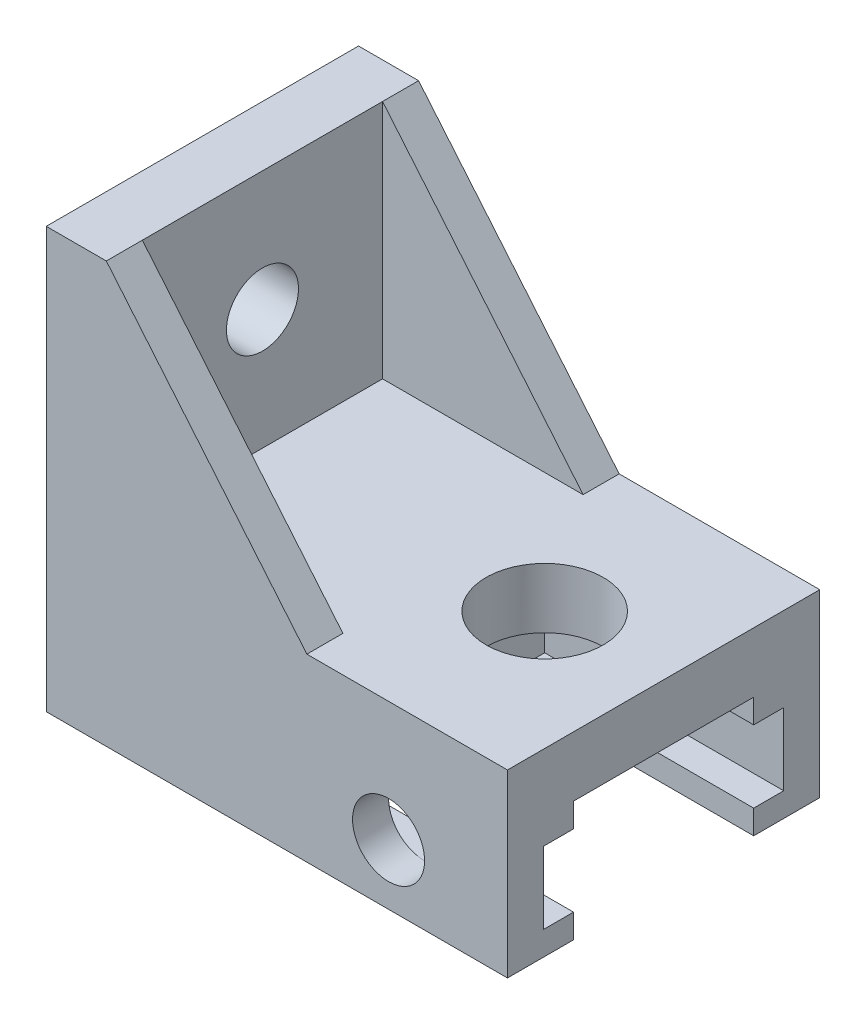
ISO-10303-21;
HEADER;
FILE_DESCRIPTION(('STEP AP214'),'2;1');
FILE_NAME('part.step','',(''),(''),'','','');
FILE_SCHEMA(('AUTOMOTIVE_DESIGN { 1 0 10303 214 1 1 1 1 }'));
ENDSEC;
DATA;
#1=APPLICATION_CONTEXT('core data for automotive mechanical design processes');
#2=APPLICATION_PROTOCOL_DEFINITION('international standard','automotive_design',2000,#1);
#3=PRODUCT_CONTEXT('',#1,'mechanical');
#4=PRODUCT('Part','Part','',(#3));
#5=PRODUCT_RELATED_PRODUCT_CATEGORY('part','',(#4));
#6=PRODUCT_DEFINITION_FORMATION('','',#4);
#7=PRODUCT_DEFINITION_CONTEXT('part definition',#1,'design');
#8=PRODUCT_DEFINITION('design','',#6,#7);
#9=PRODUCT_DEFINITION_SHAPE('','',#8);
#10=(LENGTH_UNIT() NAMED_UNIT(*) SI_UNIT(.MILLI.,.METRE.));
#11=(NAMED_UNIT(*) PLANE_ANGLE_UNIT() SI_UNIT($,.RADIAN.));
#12=(NAMED_UNIT(*) SI_UNIT($,.STERADIAN.) SOLID_ANGLE_UNIT());
#13=UNCERTAINTY_MEASURE_WITH_UNIT(LENGTH_MEASURE(1.E-05),#10,'distance_accuracy_value','');
#14=(GEOMETRIC_REPRESENTATION_CONTEXT(3) GLOBAL_UNCERTAINTY_ASSIGNED_CONTEXT((#13)) GLOBAL_UNIT_ASSIGNED_CONTEXT((#10,
#11,#12)) REPRESENTATION_CONTEXT('',''));
#15=CARTESIAN_POINT('',(0.,0.,0.));
#16=DIRECTION('',(0.,0.,1.));
#17=DIRECTION('',(1.,0.,0.));
#18=AXIS2_PLACEMENT_3D('',#15,#16,#17);
#19=CARTESIAN_POINT('',(-23.5,35.,-13.));
#20=DIRECTION('',(-1.,0.,0.));
#21=DIRECTION('',(0.,0.,1.));
#22=AXIS2_PLACEMENT_3D('',#19,#20,#21);
#23=PLANE('',#22);
#24=CARTESIAN_POINT('',(-23.5,25.,0.));
#25=DIRECTION('',(1.,0.,0.));
#26=DIRECTION('',(0.,0.,-1.));
#27=AXIS2_PLACEMENT_3D('',#24,#25,#26);
#28=CIRCLE('',#27,3.);
#29=CARTESIAN_POINT('',(-23.5,25.,-3.));
#30=VERTEX_POINT('',#29);
#31=EDGE_CURVE('E223',#30,#30,#28,.T.);
#32=ORIENTED_EDGE('',*,*,#31,.F.);
#33=EDGE_LOOP('',(#32));
#34=FACE_BOUND('',#33,.T.);
#35=DIRECTION('',(0.,-1.,0.));
#36=VECTOR('',#35,1.);
#37=CARTESIAN_POINT('',(-23.5,15.,10.));
#38=LINE('',#37,#36);
#39=CARTESIAN_POINT('',(-23.5,35.,10.));
#40=VERTEX_POINT('',#39);
#41=CARTESIAN_POINT('',(-23.5,15.,10.));
#42=VERTEX_POINT('',#41);
#43=EDGE_CURVE('E196',#40,#42,#38,.T.);
#44=ORIENTED_EDGE('',*,*,#43,.T.);
#45=DIRECTION('',(0.,0.,-1.));
#46=VECTOR('',#45,1.);
#47=CARTESIAN_POINT('',(-23.5,15.,-13.));
#48=LINE('',#47,#46);
#49=CARTESIAN_POINT('',(-23.5,15.,-10.));
#50=VERTEX_POINT('',#49);
#51=EDGE_CURVE('E204',#42,#50,#48,.T.);
#52=ORIENTED_EDGE('',*,*,#51,.T.);
#53=DIRECTION('',(0.,1.,0.));
#54=VECTOR('',#53,1.);
#55=CARTESIAN_POINT('',(-23.5,15.,-10.));
#56=LINE('',#55,#54);
#57=CARTESIAN_POINT('',(-23.5,35.,-10.));
#58=VERTEX_POINT('',#57);
#59=EDGE_CURVE('E399',#50,#58,#56,.T.);
#60=ORIENTED_EDGE('',*,*,#59,.T.);
#61=DIRECTION('',(0.,0.,-1.));
#62=VECTOR('',#61,1.);
#63=CARTESIAN_POINT('',(-23.5,35.,-13.));
#64=LINE('',#63,#62);
#65=EDGE_CURVE('E206',#40,#58,#64,.T.);
#66=ORIENTED_EDGE('',*,*,#65,.F.);
#67=EDGE_LOOP('',(#44,#52,#60,#66));
#68=FACE_BOUND('',#67,.T.);
#69=ADVANCED_FACE('F38',(#34,#68),#23,.F.);
#70=CARTESIAN_POINT('',(-10.,0.,9.99999999999999));
#71=DIRECTION('',(0.,0.,1.));
#72=DIRECTION('',(1.,0.,0.));
#73=AXIS2_PLACEMENT_3D('',#70,#71,#72);
#74=PLANE('',#73);
#75=DIRECTION('',(1.,0.,0.));
#76=VECTOR('',#75,1.);
#77=CARTESIAN_POINT('',(-10.,8.00000000000002,9.99999999999999));
#78=LINE('',#77,#76);
#79=CARTESIAN_POINT('',(-10.,8.00000000000002,9.99999999999999));
#80=VERTEX_POINT('',#79);
#81=CARTESIAN_POINT('',(0.,8.00000000000002,9.99999999999999));
#82=VERTEX_POINT('',#81);
#83=EDGE_CURVE('E333',#80,#82,#78,.T.);
#84=ORIENTED_EDGE('',*,*,#83,.T.);
#85=CARTESIAN_POINT('',(0.,5.00000000000001,9.99999999999999));
#86=DIRECTION('',(0.,0.,1.));
#87=DIRECTION('',(1.,0.,0.));
#88=AXIS2_PLACEMENT_3D('',#85,#86,#87);
#89=CIRCLE('',#88,3.);
#90=CARTESIAN_POINT('',(0.,2.00000000000002,9.99999999999999));
#91=VERTEX_POINT('',#90);
#92=EDGE_CURVE('E61',#82,#91,#89,.T.);
#93=ORIENTED_EDGE('',*,*,#92,.T.);
#94=DIRECTION('',(1.,0.,0.));
#95=VECTOR('',#94,1.);
#96=CARTESIAN_POINT('',(-10.,2.00000000000002,9.99999999999999));
#97=LINE('',#96,#95);
#98=CARTESIAN_POINT('',(-10.,2.00000000000002,9.99999999999999));
#99=VERTEX_POINT('',#98);
#100=EDGE_CURVE('E329',#99,#91,#97,.T.);
#101=ORIENTED_EDGE('',*,*,#100,.F.);
#102=DIRECTION('',(0.,-1.,0.));
#103=VECTOR('',#102,1.);
#104=CARTESIAN_POINT('',(-10.,0.,9.99999999999999));
#105=LINE('',#104,#103);
#106=EDGE_CURVE('E308',#80,#99,#105,.T.);
#107=ORIENTED_EDGE('',*,*,#106,.F.);
#108=EDGE_LOOP('',(#84,#93,#101,#107));
#109=FACE_BOUND('',#108,.T.);
#110=ADVANCED_FACE('F489',(#109),#74,.F.);
#111=CARTESIAN_POINT('',(-10.,0.,-10.));
#112=DIRECTION('',(0.,0.,1.));
#113=DIRECTION('',(0.,-1.,0.));
#114=AXIS2_PLACEMENT_3D('',#111,#112,#113);
#115=PLANE('',#114);
#116=CARTESIAN_POINT('',(0.,5.00000000000001,-10.));
#117=DIRECTION('',(0.,0.,1.));
#118=DIRECTION('',(0.,-1.,0.));
#119=AXIS2_PLACEMENT_3D('',#116,#117,#118);
#120=CIRCLE('',#119,3.);
#121=CARTESIAN_POINT('',(0.,2.00000000000001,-10.));
#122=VERTEX_POINT('',#121);
#123=CARTESIAN_POINT('',(0.,8.00000000000002,-10.));
#124=VERTEX_POINT('',#123);
#125=EDGE_CURVE('E248',#122,#124,#120,.T.);
#126=ORIENTED_EDGE('',*,*,#125,.F.);
#127=DIRECTION('',(1.,0.,0.));
#128=VECTOR('',#127,1.);
#129=CARTESIAN_POINT('',(-10.,2.00000000000002,-10.));
#130=LINE('',#129,#128);
#131=CARTESIAN_POINT('',(9.89871535516885,2.00000000000002,-10.));
#132=VERTEX_POINT('',#131);
#133=EDGE_CURVE('E354',#122,#132,#130,.T.);
#134=ORIENTED_EDGE('',*,*,#133,.T.);
#135=DIRECTION('',(0.,-1.,0.));
#136=VECTOR('',#135,1.);
#137=CARTESIAN_POINT('',(9.89871535516885,0.,-10.));
#138=LINE('',#137,#136);
#139=CARTESIAN_POINT('',(9.89871535516886,8.00000000000002,-10.));
#140=VERTEX_POINT('',#139);
#141=EDGE_CURVE('E260',#140,#132,#138,.T.);
#142=ORIENTED_EDGE('',*,*,#141,.F.);
#143=DIRECTION('',(1.,0.,0.));
#144=VECTOR('',#143,1.);
#145=CARTESIAN_POINT('',(-10.,8.00000000000002,-10.));
#146=LINE('',#145,#144);
#147=EDGE_CURVE('E350',#124,#140,#146,.T.);
#148=ORIENTED_EDGE('',*,*,#147,.F.);
#149=EDGE_LOOP('',(#126,#134,#142,#148));
#150=FACE_BOUND('',#149,.T.);
#151=ADVANCED_FACE('F464',(#150),#115,.T.);
#152=CARTESIAN_POINT('',(0.,0.,0.));
#153=DIRECTION('',(0.,1.,0.));
#154=DIRECTION('',(0.,0.,1.));
#155=AXIS2_PLACEMENT_3D('',#152,#153,#154);
#156=PLANE('',#155);
#157=DIRECTION('',(-1.,0.,0.));
#158=VECTOR('',#157,1.);
#159=CARTESIAN_POINT('',(-13.5,0.,-13.));
#160=LINE('',#159,#158);
#161=CARTESIAN_POINT('',(9.89871535516886,0.,-13.));
#162=VERTEX_POINT('',#161);
#163=CARTESIAN_POINT('',(-28.5,0.,-13.));
#164=VERTEX_POINT('',#163);
#165=EDGE_CURVE('E323',#162,#164,#160,.T.);
#166=ORIENTED_EDGE('',*,*,#165,.F.);
#167=DIRECTION('',(0.,0.,-1.));
#168=VECTOR('',#167,1.);
#169=CARTESIAN_POINT('',(9.89871535516886,0.,13.));
#170=LINE('',#169,#168);
#171=CARTESIAN_POINT('',(9.89871535516886,0.,-7.50000000000002));
#172=VERTEX_POINT('',#171);
#173=EDGE_CURVE('E254',#172,#162,#170,.T.);
#174=ORIENTED_EDGE('',*,*,#173,.F.);
#175=DIRECTION('',(1.,0.,0.));
#176=VECTOR('',#175,1.);
#177=CARTESIAN_POINT('',(-10.,0.,-7.50000000000001));
#178=LINE('',#177,#176);
#179=CARTESIAN_POINT('',(-10.,0.,-7.50000000000001));
#180=VERTEX_POINT('',#179);
#181=EDGE_CURVE('E320',#180,#172,#178,.T.);
#182=ORIENTED_EDGE('',*,*,#181,.F.);
#183=DIRECTION('',(0.,0.,-1.));
#184=VECTOR('',#183,1.);
#185=CARTESIAN_POINT('',(-10.,0.,0.));
#186=LINE('',#185,#184);
#187=CARTESIAN_POINT('',(-10.,0.,7.49999999999999));
#188=VERTEX_POINT('',#187);
#189=EDGE_CURVE('E316',#188,#180,#186,.T.);
#190=ORIENTED_EDGE('',*,*,#189,.F.);
#191=DIRECTION('',(1.,0.,0.));
#192=VECTOR('',#191,1.);
#193=CARTESIAN_POINT('',(-10.,0.,7.49999999999999));
#194=LINE('',#193,#192);
#195=CARTESIAN_POINT('',(9.89871535516886,0.,7.49999999999998));
#196=VERTEX_POINT('',#195);
#197=EDGE_CURVE('E324',#188,#196,#194,.T.);
#198=ORIENTED_EDGE('',*,*,#197,.T.);
#199=CARTESIAN_POINT('',(9.89871535516886,0.,13.));
#200=VERTEX_POINT('',#199);
#201=EDGE_CURVE('E261',#200,#196,#170,.T.);
#202=ORIENTED_EDGE('',*,*,#201,.F.);
#203=DIRECTION('',(1.,0.,0.));
#204=VECTOR('',#203,1.);
#205=CARTESIAN_POINT('',(-13.5,0.,13.));
#206=LINE('',#205,#204);
#207=CARTESIAN_POINT('',(-28.5,0.,13.));
#208=VERTEX_POINT('',#207);
#209=EDGE_CURVE('E359',#208,#200,#206,.T.);
#210=ORIENTED_EDGE('',*,*,#209,.F.);
#211=DIRECTION('',(0.,0.,1.));
#212=VECTOR('',#211,1.);
#213=CARTESIAN_POINT('',(-28.5,0.,-13.));
#214=LINE('',#213,#212);
#215=EDGE_CURVE('E232',#164,#208,#214,.T.);
#216=ORIENTED_EDGE('',*,*,#215,.F.);
#217=EDGE_LOOP('',(#166,#174,#182,#190,#198,#202,#210,#216));
#218=FACE_BOUND('',#217,.T.);
#219=ADVANCED_FACE('F373',(#218),#156,.F.);
#220=CARTESIAN_POINT('',(-13.5,15.,-13.));
#221=DIRECTION('',(0.,0.,1.));
#222=DIRECTION('',(1.,0.,0.));
#223=AXIS2_PLACEMENT_3D('',#220,#221,#222);
#224=PLANE('',#223);
#225=CARTESIAN_POINT('',(0.,5.00000000000001,-13.));
#226=DIRECTION('',(0.,0.,-1.));
#227=DIRECTION('',(-1.,0.,0.));
#228=AXIS2_PLACEMENT_3D('',#225,#226,#227);
#229=CIRCLE('',#228,3.);
#230=CARTESIAN_POINT('',(-3.,5.00000000000001,-13.));
#231=VERTEX_POINT('',#230);
#232=EDGE_CURVE('E244',#231,#231,#229,.T.);
#233=ORIENTED_EDGE('',*,*,#232,.F.);
#234=EDGE_LOOP('',(#233));
#235=FACE_BOUND('',#234,.T.);
#236=DIRECTION('',(-1.,0.,0.));
#237=VECTOR('',#236,1.);
#238=CARTESIAN_POINT('',(-13.5,15.,-13.));
#239=LINE('',#238,#237);
#240=CARTESIAN_POINT('',(9.89871535516886,15.,-13.));
#241=VERTEX_POINT('',#240);
#242=CARTESIAN_POINT('',(-6.80064232241557,15.,-13.));
#243=VERTEX_POINT('',#242);
#244=EDGE_CURVE('E356',#241,#243,#239,.T.);
#245=ORIENTED_EDGE('',*,*,#244,.F.);
#246=DIRECTION('',(0.,1.,0.));
#247=VECTOR('',#246,1.);
#248=CARTESIAN_POINT('',(9.89871535516886,15.,-13.));
#249=LINE('',#248,#247);
#250=EDGE_CURVE('E255',#162,#241,#249,.T.);
#251=ORIENTED_EDGE('',*,*,#250,.F.);
#252=ORIENTED_EDGE('',*,*,#165,.T.);
#253=DIRECTION('',(0.,-1.,0.));
#254=VECTOR('',#253,1.);
#255=CARTESIAN_POINT('',(-28.5,15.,-13.));
#256=LINE('',#255,#254);
#257=CARTESIAN_POINT('',(-28.5,35.,-13.));
#258=VERTEX_POINT('',#257);
#259=EDGE_CURVE('E229',#258,#164,#256,.T.);
#260=ORIENTED_EDGE('',*,*,#259,.F.);
#261=DIRECTION('',(-1.,0.,0.));
#262=VECTOR('',#261,1.);
#263=CARTESIAN_POINT('',(-28.5,35.,-13.));
#264=LINE('',#263,#262);
#265=CARTESIAN_POINT('',(-23.5,35.,-13.));
#266=VERTEX_POINT('',#265);
#267=EDGE_CURVE('E227',#266,#258,#264,.T.);
#268=ORIENTED_EDGE('',*,*,#267,.F.);
#269=DIRECTION('',(0.640924573481282,-0.767603863400802,0.));
#270=VECTOR('',#269,1.);
#271=CARTESIAN_POINT('',(-23.5,35.,-13.));
#272=LINE('',#271,#270);
#273=EDGE_CURVE('E397',#266,#243,#272,.T.);
#274=ORIENTED_EDGE('',*,*,#273,.T.);
#275=EDGE_LOOP('',(#245,#251,#252,#260,#268,#274));
#276=FACE_BOUND('',#275,.T.);
#277=ADVANCED_FACE('F40',(#235,#276),#224,.F.);
#278=CARTESIAN_POINT('',(-13.5,15.,13.));
#279=DIRECTION('',(0.,0.,-1.));
#280=DIRECTION('',(-1.,0.,0.));
#281=AXIS2_PLACEMENT_3D('',#278,#279,#280);
#282=PLANE('',#281);
#283=DIRECTION('',(1.,0.,0.));
#284=VECTOR('',#283,1.);
#285=CARTESIAN_POINT('',(-13.5,15.,13.));
#286=LINE('',#285,#284);
#287=CARTESIAN_POINT('',(-6.80064232241557,15.,13.));
#288=VERTEX_POINT('',#287);
#289=CARTESIAN_POINT('',(9.89871535516886,15.,13.));
#290=VERTEX_POINT('',#289);
#291=EDGE_CURVE('E47',#288,#290,#286,.T.);
#292=ORIENTED_EDGE('',*,*,#291,.F.);
#293=DIRECTION('',(-0.640924573481282,0.767603863400802,0.));
#294=VECTOR('',#293,1.);
#295=CARTESIAN_POINT('',(-23.5,35.,13.));
#296=LINE('',#295,#294);
#297=CARTESIAN_POINT('',(-23.5,35.,13.));
#298=VERTEX_POINT('',#297);
#299=EDGE_CURVE('E208',#288,#298,#296,.T.);
#300=ORIENTED_EDGE('',*,*,#299,.T.);
#301=DIRECTION('',(1.,0.,0.));
#302=VECTOR('',#301,1.);
#303=CARTESIAN_POINT('',(-28.5,35.,13.));
#304=LINE('',#303,#302);
#305=CARTESIAN_POINT('',(-28.5,35.,13.));
#306=VERTEX_POINT('',#305);
#307=EDGE_CURVE('E220',#306,#298,#304,.T.);
#308=ORIENTED_EDGE('',*,*,#307,.F.);
#309=DIRECTION('',(0.,1.,0.));
#310=VECTOR('',#309,1.);
#311=CARTESIAN_POINT('',(-28.5,15.,13.));
#312=LINE('',#311,#310);
#313=EDGE_CURVE('E235',#208,#306,#312,.T.);
#314=ORIENTED_EDGE('',*,*,#313,.F.);
#315=ORIENTED_EDGE('',*,*,#209,.T.);
#316=DIRECTION('',(0.,1.,0.));
#317=VECTOR('',#316,1.);
#318=CARTESIAN_POINT('',(9.89871535516886,15.,13.));
#319=LINE('',#318,#317);
#320=EDGE_CURVE('E251',#200,#290,#319,.T.);
#321=ORIENTED_EDGE('',*,*,#320,.T.);
#322=EDGE_LOOP('',(#292,#300,#308,#314,#315,#321));
#323=FACE_BOUND('',#322,.T.);
#324=CARTESIAN_POINT('',(0.,5.00000000000001,13.));
#325=DIRECTION('',(0.,0.,-1.));
#326=DIRECTION('',(-1.,0.,0.));
#327=AXIS2_PLACEMENT_3D('',#324,#325,#326);
#328=CIRCLE('',#327,3.);
#329=CARTESIAN_POINT('',(-3.,5.00000000000001,13.));
#330=VERTEX_POINT('',#329);
#331=EDGE_CURVE('E240',#330,#330,#328,.T.);
#332=ORIENTED_EDGE('',*,*,#331,.T.);
#333=EDGE_LOOP('',(#332));
#334=FACE_BOUND('',#333,.T.);
#335=ADVANCED_FACE('F366',(#323,#334),#282,.F.);
#336=CARTESIAN_POINT('',(0.,15.,0.));
#337=DIRECTION('',(0.,1.,0.));
#338=DIRECTION('',(0.,0.,1.));
#339=AXIS2_PLACEMENT_3D('',#336,#337,#338);
#340=PLANE('',#339);
#341=DIRECTION('',(0.,0.,1.));
#342=VECTOR('',#341,1.);
#343=CARTESIAN_POINT('',(-6.80064232241557,15.,10.));
#344=LINE('',#343,#342);
#345=CARTESIAN_POINT('',(-6.80064232241557,15.,10.));
#346=VERTEX_POINT('',#345);
#347=EDGE_CURVE('E400',#346,#288,#344,.T.);
#348=ORIENTED_EDGE('',*,*,#347,.T.);
#349=ORIENTED_EDGE('',*,*,#291,.T.);
#350=DIRECTION('',(0.,0.,-1.));
#351=VECTOR('',#350,1.);
#352=CARTESIAN_POINT('',(9.89871535516886,15.,13.));
#353=LINE('',#352,#351);
#354=EDGE_CURVE('E257',#290,#241,#353,.T.);
#355=ORIENTED_EDGE('',*,*,#354,.T.);
#356=ORIENTED_EDGE('',*,*,#244,.T.);
#357=DIRECTION('',(0.,0.,-1.));
#358=VECTOR('',#357,1.);
#359=CARTESIAN_POINT('',(-6.80064232241557,15.,-10.));
#360=LINE('',#359,#358);
#361=CARTESIAN_POINT('',(-6.80064232241557,15.,-10.));
#362=VERTEX_POINT('',#361);
#363=EDGE_CURVE('E394',#362,#243,#360,.T.);
#364=ORIENTED_EDGE('',*,*,#363,.F.);
#365=DIRECTION('',(-1.,0.,0.));
#366=VECTOR('',#365,1.);
#367=CARTESIAN_POINT('',(-6.80064232241557,15.,-10.));
#368=LINE('',#367,#366);
#369=EDGE_CURVE('E215',#362,#50,#368,.T.);
#370=ORIENTED_EDGE('',*,*,#369,.T.);
#371=ORIENTED_EDGE('',*,*,#51,.F.);
#372=DIRECTION('',(1.,0.,0.));
#373=VECTOR('',#372,1.);
#374=CARTESIAN_POINT('',(-6.80064232241557,15.,10.));
#375=LINE('',#374,#373);
#376=EDGE_CURVE('E193',#42,#346,#375,.T.);
#377=ORIENTED_EDGE('',*,*,#376,.T.);
#378=EDGE_LOOP('',(#348,#349,#355,#356,#364,#370,#371,#377));
#379=FACE_BOUND('',#378,.T.);
#380=CARTESIAN_POINT('',(0.,15.,0.));
#381=DIRECTION('',(0.,1.,0.));
#382=DIRECTION('',(0.,0.,1.));
#383=AXIS2_PLACEMENT_3D('',#380,#381,#382);
#384=CIRCLE('',#383,4.875);
#385=CARTESIAN_POINT('',(0.,15.,4.875));
#386=VERTEX_POINT('',#385);
#387=EDGE_CURVE('E237',#386,#386,#384,.T.);
#388=ORIENTED_EDGE('',*,*,#387,.F.);
#389=EDGE_LOOP('',(#388));
#390=FACE_BOUND('',#389,.T.);
#391=ADVANCED_FACE('F211',(#379,#390),#340,.T.);
#392=CARTESIAN_POINT('',(-10.,0.,-7.50000000000001));
#393=DIRECTION('',(0.,0.,1.));
#394=DIRECTION('',(1.,0.,0.));
#395=AXIS2_PLACEMENT_3D('',#392,#393,#394);
#396=PLANE('',#395);
#397=DIRECTION('',(0.,-1.,0.));
#398=VECTOR('',#397,1.);
#399=CARTESIAN_POINT('',(9.89871535516885,0.,-7.50000000000001));
#400=LINE('',#399,#398);
#401=CARTESIAN_POINT('',(9.89871535516886,2.00000000000002,-7.50000000000001));
#402=VERTEX_POINT('',#401);
#403=EDGE_CURVE('E288',#402,#172,#400,.T.);
#404=ORIENTED_EDGE('',*,*,#403,.F.);
#405=DIRECTION('',(1.,0.,0.));
#406=VECTOR('',#405,1.);
#407=CARTESIAN_POINT('',(-10.,2.00000000000002,-7.50000000000001));
#408=LINE('',#407,#406);
#409=CARTESIAN_POINT('',(-10.,2.00000000000002,-7.50000000000001));
#410=VERTEX_POINT('',#409);
#411=EDGE_CURVE('E319',#410,#402,#408,.T.);
#412=ORIENTED_EDGE('',*,*,#411,.F.);
#413=DIRECTION('',(0.,-1.,0.));
#414=VECTOR('',#413,1.);
#415=CARTESIAN_POINT('',(-10.,0.,-7.50000000000001));
#416=LINE('',#415,#414);
#417=EDGE_CURVE('E290',#410,#180,#416,.T.);
#418=ORIENTED_EDGE('',*,*,#417,.T.);
#419=ORIENTED_EDGE('',*,*,#181,.T.);
#420=EDGE_LOOP('',(#404,#412,#418,#419));
#421=FACE_BOUND('',#420,.T.);
#422=ADVANCED_FACE('F417',(#421),#396,.T.);
#423=CARTESIAN_POINT('',(-10.,0.,7.49999999999999));
#424=DIRECTION('',(0.,0.,1.));
#425=DIRECTION('',(1.,0.,0.));
#426=AXIS2_PLACEMENT_3D('',#423,#424,#425);
#427=PLANE('',#426);
#428=DIRECTION('',(1.,0.,0.));
#429=VECTOR('',#428,1.);
#430=CARTESIAN_POINT('',(-10.,2.00000000000002,7.49999999999999));
#431=LINE('',#430,#429);
#432=CARTESIAN_POINT('',(-10.,2.00000000000002,7.49999999999999));
#433=VERTEX_POINT('',#432);
#434=CARTESIAN_POINT('',(9.89871535516886,2.00000000000002,7.49999999999998));
#435=VERTEX_POINT('',#434);
#436=EDGE_CURVE('E327',#433,#435,#431,.T.);
#437=ORIENTED_EDGE('',*,*,#436,.T.);
#438=DIRECTION('',(0.,-1.,0.));
#439=VECTOR('',#438,1.);
#440=CARTESIAN_POINT('',(9.89871535516885,0.,7.49999999999998));
#441=LINE('',#440,#439);
#442=EDGE_CURVE('E285',#435,#196,#441,.T.);
#443=ORIENTED_EDGE('',*,*,#442,.T.);
#444=ORIENTED_EDGE('',*,*,#197,.F.);
#445=DIRECTION('',(0.,-1.,0.));
#446=VECTOR('',#445,1.);
#447=CARTESIAN_POINT('',(-10.,0.,7.49999999999999));
#448=LINE('',#447,#446);
#449=EDGE_CURVE('E314',#433,#188,#448,.T.);
#450=ORIENTED_EDGE('',*,*,#449,.F.);
#451=EDGE_LOOP('',(#437,#443,#444,#450));
#452=FACE_BOUND('',#451,.T.);
#453=ADVANCED_FACE('F425',(#452),#427,.F.);
#454=CARTESIAN_POINT('',(-10.,2.00000000000002,0.));
#455=DIRECTION('',(0.,-1.,0.));
#456=DIRECTION('',(0.,0.,-1.));
#457=AXIS2_PLACEMENT_3D('',#454,#455,#456);
#458=PLANE('',#457);
#459=ORIENTED_EDGE('',*,*,#100,.T.);
#460=CARTESIAN_POINT('',(9.89871535516885,2.00000000000002,9.99999999999999));
#461=VERTEX_POINT('',#460);
#462=EDGE_CURVE('E332',#91,#461,#97,.T.);
#463=ORIENTED_EDGE('',*,*,#462,.T.);
#464=DIRECTION('',(0.,0.,-1.));
#465=VECTOR('',#464,1.);
#466=CARTESIAN_POINT('',(9.89871535516886,2.00000000000002,0.));
#467=LINE('',#466,#465);
#468=EDGE_CURVE('E282',#461,#435,#467,.T.);
#469=ORIENTED_EDGE('',*,*,#468,.T.);
#470=ORIENTED_EDGE('',*,*,#436,.F.);
#471=DIRECTION('',(0.,0.,-1.));
#472=VECTOR('',#471,1.);
#473=CARTESIAN_POINT('',(-10.,2.00000000000002,0.));
#474=LINE('',#473,#472);
#475=EDGE_CURVE('E311',#99,#433,#474,.T.);
#476=ORIENTED_EDGE('',*,*,#475,.F.);
#477=EDGE_LOOP('',(#459,#463,#469,#470,#476));
#478=FACE_BOUND('',#477,.T.);
#479=ADVANCED_FACE('F430',(#478),#458,.F.);
#480=ORIENTED_EDGE('',*,*,#462,.F.);
#481=EDGE_CURVE('E249',#91,#82,#89,.T.);
#482=ORIENTED_EDGE('',*,*,#481,.T.);
#483=CARTESIAN_POINT('',(9.89871535516886,8.00000000000002,9.99999999999999));
#484=VERTEX_POINT('',#483);
#485=EDGE_CURVE('E336',#82,#484,#78,.T.);
#486=ORIENTED_EDGE('',*,*,#485,.T.);
#487=DIRECTION('',(0.,-1.,0.));
#488=VECTOR('',#487,1.);
#489=CARTESIAN_POINT('',(9.89871535516885,0.,9.99999999999999));
#490=LINE('',#489,#488);
#491=EDGE_CURVE('E279',#484,#461,#490,.T.);
#492=ORIENTED_EDGE('',*,*,#491,.T.);
#493=EDGE_LOOP('',(#480,#482,#486,#492));
#494=FACE_BOUND('',#493,.T.);
#495=ADVANCED_FACE('F434',(#494),#74,.F.);
#496=CARTESIAN_POINT('',(-10.,8.00000000000002,0.));
#497=DIRECTION('',(0.,-1.,0.));
#498=DIRECTION('',(0.,0.,-1.));
#499=AXIS2_PLACEMENT_3D('',#496,#497,#498);
#500=PLANE('',#499);
#501=DIRECTION('',(1.,0.,0.));
#502=VECTOR('',#501,1.);
#503=CARTESIAN_POINT('',(-10.,8.00000000000002,7.49999999999999));
#504=LINE('',#503,#502);
#505=CARTESIAN_POINT('',(-10.,8.00000000000002,7.49999999999999));
#506=VERTEX_POINT('',#505);
#507=CARTESIAN_POINT('',(9.89871535516886,8.00000000000002,7.49999999999998));
#508=VERTEX_POINT('',#507);
#509=EDGE_CURVE('E337',#506,#508,#504,.T.);
#510=ORIENTED_EDGE('',*,*,#509,.T.);
#511=DIRECTION('',(0.,0.,-1.));
#512=VECTOR('',#511,1.);
#513=CARTESIAN_POINT('',(9.89871535516886,8.00000000000002,0.));
#514=LINE('',#513,#512);
#515=EDGE_CURVE('E276',#484,#508,#514,.T.);
#516=ORIENTED_EDGE('',*,*,#515,.F.);
#517=ORIENTED_EDGE('',*,*,#485,.F.);
#518=ORIENTED_EDGE('',*,*,#83,.F.);
#519=DIRECTION('',(0.,0.,-1.));
#520=VECTOR('',#519,1.);
#521=CARTESIAN_POINT('',(-10.,8.00000000000002,0.));
#522=LINE('',#521,#520);
#523=EDGE_CURVE('E306',#80,#506,#522,.T.);
#524=ORIENTED_EDGE('',*,*,#523,.T.);
#525=EDGE_LOOP('',(#510,#516,#517,#518,#524));
#526=FACE_BOUND('',#525,.T.);
#527=ADVANCED_FACE('F438',(#526),#500,.T.);
#528=CARTESIAN_POINT('',(-10.,0.,7.49999999999999));
#529=DIRECTION('',(0.,0.,1.));
#530=DIRECTION('',(1.,0.,0.));
#531=AXIS2_PLACEMENT_3D('',#528,#529,#530);
#532=PLANE('',#531);
#533=DIRECTION('',(1.,0.,0.));
#534=VECTOR('',#533,1.);
#535=CARTESIAN_POINT('',(-10.,10.,7.49999999999999));
#536=LINE('',#535,#534);
#537=CARTESIAN_POINT('',(-10.,10.,7.49999999999999));
#538=VERTEX_POINT('',#537);
#539=CARTESIAN_POINT('',(9.89871535516886,10.,7.49999999999999));
#540=VERTEX_POINT('',#539);
#541=EDGE_CURVE('E339',#538,#540,#536,.T.);
#542=ORIENTED_EDGE('',*,*,#541,.T.);
#543=DIRECTION('',(0.,-1.,0.));
#544=VECTOR('',#543,1.);
#545=CARTESIAN_POINT('',(9.89871535516885,0.,7.49999999999998));
#546=LINE('',#545,#544);
#547=EDGE_CURVE('E273',#540,#508,#546,.T.);
#548=ORIENTED_EDGE('',*,*,#547,.T.);
#549=ORIENTED_EDGE('',*,*,#509,.F.);
#550=DIRECTION('',(0.,-1.,0.));
#551=VECTOR('',#550,1.);
#552=CARTESIAN_POINT('',(-10.,0.,7.49999999999999));
#553=LINE('',#552,#551);
#554=EDGE_CURVE('E303',#538,#506,#553,.T.);
#555=ORIENTED_EDGE('',*,*,#554,.F.);
#556=EDGE_LOOP('',(#542,#548,#549,#555));
#557=FACE_BOUND('',#556,.T.);
#558=ADVANCED_FACE('F443',(#557),#532,.F.);
#559=CARTESIAN_POINT('',(-10.,10.,0.));
#560=DIRECTION('',(0.,-1.,0.));
#561=DIRECTION('',(0.,0.,-1.));
#562=AXIS2_PLACEMENT_3D('',#559,#560,#561);
#563=PLANE('',#562);
#564=CARTESIAN_POINT('',(0.,10.,0.));
#565=DIRECTION('',(0.,-1.,0.));
#566=DIRECTION('',(0.,0.,-1.));
#567=AXIS2_PLACEMENT_3D('',#564,#565,#566);
#568=CIRCLE('',#567,4.875);
#569=CARTESIAN_POINT('',(0.,10.,-4.875));
#570=VERTEX_POINT('',#569);
#571=EDGE_CURVE('E42',#570,#570,#568,.T.);
#572=ORIENTED_EDGE('',*,*,#571,.F.);
#573=EDGE_LOOP('',(#572));
#574=FACE_BOUND('',#573,.T.);
#575=DIRECTION('',(0.,0.,-1.));
#576=VECTOR('',#575,1.);
#577=CARTESIAN_POINT('',(9.89871535516886,10.,0.));
#578=LINE('',#577,#576);
#579=CARTESIAN_POINT('',(9.89871535516886,10.,-7.50000000000001));
#580=VERTEX_POINT('',#579);
#581=EDGE_CURVE('E271',#540,#580,#578,.T.);
#582=ORIENTED_EDGE('',*,*,#581,.F.);
#583=ORIENTED_EDGE('',*,*,#541,.F.);
#584=DIRECTION('',(0.,0.,-1.));
#585=VECTOR('',#584,1.);
#586=CARTESIAN_POINT('',(-10.,10.,0.));
#587=LINE('',#586,#585);
#588=CARTESIAN_POINT('',(-10.,10.,-7.50000000000001));
#589=VERTEX_POINT('',#588);
#590=EDGE_CURVE('E301',#538,#589,#587,.T.);
#591=ORIENTED_EDGE('',*,*,#590,.T.);
#592=DIRECTION('',(1.,0.,0.));
#593=VECTOR('',#592,1.);
#594=CARTESIAN_POINT('',(-10.,10.,-7.50000000000001));
#595=LINE('',#594,#593);
#596=EDGE_CURVE('E342',#589,#580,#595,.T.);
#597=ORIENTED_EDGE('',*,*,#596,.T.);
#598=EDGE_LOOP('',(#582,#583,#591,#597));
#599=FACE_BOUND('',#598,.T.);
#600=ADVANCED_FACE('F451',(#574,#599),#563,.T.);
#601=CARTESIAN_POINT('',(-10.,0.,-7.50000000000001));
#602=DIRECTION('',(0.,0.,1.));
#603=DIRECTION('',(1.,0.,0.));
#604=AXIS2_PLACEMENT_3D('',#601,#602,#603);
#605=PLANE('',#604);
#606=DIRECTION('',(0.,-1.,0.));
#607=VECTOR('',#606,1.);
#608=CARTESIAN_POINT('',(9.89871535516885,0.,-7.50000000000001));
#609=LINE('',#608,#607);
#610=CARTESIAN_POINT('',(9.89871535516886,8.00000000000002,-7.50000000000001));
#611=VERTEX_POINT('',#610);
#612=EDGE_CURVE('E268',#580,#611,#609,.T.);
#613=ORIENTED_EDGE('',*,*,#612,.F.);
#614=ORIENTED_EDGE('',*,*,#596,.F.);
#615=DIRECTION('',(0.,-1.,0.));
#616=VECTOR('',#615,1.);
#617=CARTESIAN_POINT('',(-10.,0.,-7.50000000000001));
#618=LINE('',#617,#616);
#619=CARTESIAN_POINT('',(-10.,8.00000000000002,-7.50000000000001));
#620=VERTEX_POINT('',#619);
#621=EDGE_CURVE('E299',#589,#620,#618,.T.);
#622=ORIENTED_EDGE('',*,*,#621,.T.);
#623=DIRECTION('',(1.,0.,0.));
#624=VECTOR('',#623,1.);
#625=CARTESIAN_POINT('',(-10.,8.00000000000002,-7.50000000000001));
#626=LINE('',#625,#624);
#627=EDGE_CURVE('E345',#620,#611,#626,.T.);
#628=ORIENTED_EDGE('',*,*,#627,.T.);
#629=EDGE_LOOP('',(#613,#614,#622,#628));
#630=FACE_BOUND('',#629,.T.);
#631=ADVANCED_FACE('F454',(#630),#605,.T.);
#632=CARTESIAN_POINT('',(-10.,8.00000000000002,0.));
#633=DIRECTION('',(0.,-1.,0.));
#634=DIRECTION('',(0.,0.,-1.));
#635=AXIS2_PLACEMENT_3D('',#632,#633,#634);
#636=PLANE('',#635);
#637=CARTESIAN_POINT('',(-10.,8.00000000000002,-10.));
#638=VERTEX_POINT('',#637);
#639=EDGE_CURVE('E347',#638,#124,#146,.T.);
#640=ORIENTED_EDGE('',*,*,#639,.T.);
#641=ORIENTED_EDGE('',*,*,#147,.T.);
#642=DIRECTION('',(0.,0.,-1.));
#643=VECTOR('',#642,1.);
#644=CARTESIAN_POINT('',(9.89871535516886,8.00000000000002,0.));
#645=LINE('',#644,#643);
#646=EDGE_CURVE('E265',#611,#140,#645,.T.);
#647=ORIENTED_EDGE('',*,*,#646,.F.);
#648=ORIENTED_EDGE('',*,*,#627,.F.);
#649=DIRECTION('',(0.,0.,-1.));
#650=VECTOR('',#649,1.);
#651=CARTESIAN_POINT('',(-10.,8.00000000000002,0.));
#652=LINE('',#651,#650);
#653=EDGE_CURVE('E297',#620,#638,#652,.T.);
#654=ORIENTED_EDGE('',*,*,#653,.T.);
#655=EDGE_LOOP('',(#640,#641,#647,#648,#654));
#656=FACE_BOUND('',#655,.T.);
#657=ADVANCED_FACE('F459',(#656),#636,.T.);
#658=EDGE_CURVE('E243',#124,#122,#120,.T.);
#659=ORIENTED_EDGE('',*,*,#658,.F.);
#660=ORIENTED_EDGE('',*,*,#639,.F.);
#661=DIRECTION('',(0.,-1.,0.));
#662=VECTOR('',#661,1.);
#663=CARTESIAN_POINT('',(-10.,0.,-10.));
#664=LINE('',#663,#662);
#665=CARTESIAN_POINT('',(-10.,2.00000000000002,-10.));
#666=VERTEX_POINT('',#665);
#667=EDGE_CURVE('E295',#638,#666,#664,.T.);
#668=ORIENTED_EDGE('',*,*,#667,.T.);
#669=EDGE_CURVE('E351',#666,#122,#130,.T.);
#670=ORIENTED_EDGE('',*,*,#669,.T.);
#671=EDGE_LOOP('',(#659,#660,#668,#670));
#672=FACE_BOUND('',#671,.T.);
#673=ADVANCED_FACE('F473',(#672),#115,.T.);
#674=CARTESIAN_POINT('',(-10.,2.00000000000002,0.));
#675=DIRECTION('',(0.,-1.,0.));
#676=DIRECTION('',(0.,0.,-1.));
#677=AXIS2_PLACEMENT_3D('',#674,#675,#676);
#678=PLANE('',#677);
#679=ORIENTED_EDGE('',*,*,#411,.T.);
#680=DIRECTION('',(0.,0.,-1.));
#681=VECTOR('',#680,1.);
#682=CARTESIAN_POINT('',(9.89871535516886,2.00000000000002,0.));
#683=LINE('',#682,#681);
#684=EDGE_CURVE('E11',#402,#132,#683,.T.);
#685=ORIENTED_EDGE('',*,*,#684,.T.);
#686=ORIENTED_EDGE('',*,*,#133,.F.);
#687=ORIENTED_EDGE('',*,*,#669,.F.);
#688=DIRECTION('',(0.,0.,-1.));
#689=VECTOR('',#688,1.);
#690=CARTESIAN_POINT('',(-10.,2.00000000000002,0.));
#691=LINE('',#690,#689);
#692=EDGE_CURVE('E292',#410,#666,#691,.T.);
#693=ORIENTED_EDGE('',*,*,#692,.F.);
#694=EDGE_LOOP('',(#679,#685,#686,#687,#693));
#695=FACE_BOUND('',#694,.T.);
#696=ADVANCED_FACE('F468',(#695),#678,.F.);
#697=CARTESIAN_POINT('',(-10.,0.,0.));
#698=DIRECTION('',(1.,0.,0.));
#699=DIRECTION('',(0.,0.,-1.));
#700=AXIS2_PLACEMENT_3D('',#697,#698,#699);
#701=PLANE('',#700);
#702=ORIENTED_EDGE('',*,*,#417,.F.);
#703=ORIENTED_EDGE('',*,*,#692,.T.);
#704=ORIENTED_EDGE('',*,*,#667,.F.);
#705=ORIENTED_EDGE('',*,*,#653,.F.);
#706=ORIENTED_EDGE('',*,*,#621,.F.);
#707=ORIENTED_EDGE('',*,*,#590,.F.);
#708=ORIENTED_EDGE('',*,*,#554,.T.);
#709=ORIENTED_EDGE('',*,*,#523,.F.);
#710=ORIENTED_EDGE('',*,*,#106,.T.);
#711=ORIENTED_EDGE('',*,*,#475,.T.);
#712=ORIENTED_EDGE('',*,*,#449,.T.);
#713=ORIENTED_EDGE('',*,*,#189,.T.);
#714=EDGE_LOOP('',(#702,#703,#704,#705,#706,#707,#708,#709,#710,#711,#712,#713));
#715=FACE_BOUND('',#714,.T.);
#716=ADVANCED_FACE('F421',(#715),#701,.T.);
#717=CARTESIAN_POINT('',(9.89871535516886,15.,13.));
#718=DIRECTION('',(-1.,0.,0.));
#719=DIRECTION('',(0.,-1.,0.));
#720=AXIS2_PLACEMENT_3D('',#717,#718,#719);
#721=PLANE('',#720);
#722=ORIENTED_EDGE('',*,*,#403,.T.);
#723=ORIENTED_EDGE('',*,*,#173,.T.);
#724=ORIENTED_EDGE('',*,*,#250,.T.);
#725=ORIENTED_EDGE('',*,*,#354,.F.);
#726=ORIENTED_EDGE('',*,*,#320,.F.);
#727=ORIENTED_EDGE('',*,*,#201,.T.);
#728=ORIENTED_EDGE('',*,*,#442,.F.);
#729=ORIENTED_EDGE('',*,*,#468,.F.);
#730=ORIENTED_EDGE('',*,*,#491,.F.);
#731=ORIENTED_EDGE('',*,*,#515,.T.);
#732=ORIENTED_EDGE('',*,*,#547,.F.);
#733=ORIENTED_EDGE('',*,*,#581,.T.);
#734=ORIENTED_EDGE('',*,*,#612,.T.);
#735=ORIENTED_EDGE('',*,*,#646,.T.);
#736=ORIENTED_EDGE('',*,*,#141,.T.);
#737=ORIENTED_EDGE('',*,*,#684,.F.);
#738=EDGE_LOOP('',(#722,#723,#724,#725,#726,#727,#728,#729,#730,#731,#732,#733,#734,#735,#736,#737));
#739=FACE_BOUND('',#738,.T.);
#740=ADVANCED_FACE('F411',(#739),#721,.F.);
#741=CARTESIAN_POINT('',(0.,5.00000000000001,13.));
#742=DIRECTION('',(0.,0.,-1.));
#743=DIRECTION('',(-1.,0.,0.));
#744=AXIS2_PLACEMENT_3D('',#741,#742,#743);
#745=CYLINDRICAL_SURFACE('',#744,3.);
#746=ORIENTED_EDGE('',*,*,#125,.T.);
#747=ORIENTED_EDGE('',*,*,#658,.T.);
#748=EDGE_LOOP('',(#746,#747));
#749=FACE_BOUND('',#748,.T.);
#750=ORIENTED_EDGE('',*,*,#232,.T.);
#751=EDGE_LOOP('',(#750));
#752=FACE_BOUND('',#751,.T.);
#753=ADVANCED_FACE('F475',(#749,#752),#745,.F.);
#754=ORIENTED_EDGE('',*,*,#331,.F.);
#755=EDGE_LOOP('',(#754));
#756=FACE_BOUND('',#755,.T.);
#757=ORIENTED_EDGE('',*,*,#481,.F.);
#758=ORIENTED_EDGE('',*,*,#92,.F.);
#759=EDGE_LOOP('',(#757,#758));
#760=FACE_BOUND('',#759,.T.);
#761=ADVANCED_FACE('F478',(#756,#760),#745,.F.);
#762=CARTESIAN_POINT('',(0.,0.,0.));
#763=DIRECTION('',(0.,1.,0.));
#764=DIRECTION('',(0.,0.,1.));
#765=AXIS2_PLACEMENT_3D('',#762,#763,#764);
#766=CYLINDRICAL_SURFACE('',#765,4.875);
#767=ORIENTED_EDGE('',*,*,#571,.T.);
#768=EDGE_LOOP('',(#767));
#769=FACE_BOUND('',#768,.T.);
#770=ORIENTED_EDGE('',*,*,#387,.T.);
#771=EDGE_LOOP('',(#770));
#772=FACE_BOUND('',#771,.T.);
#773=ADVANCED_FACE('F503',(#769,#772),#766,.F.);
#774=CARTESIAN_POINT('',(-28.5,0.,0.));
#775=DIRECTION('',(-1.,0.,0.));
#776=DIRECTION('',(0.,0.,1.));
#777=AXIS2_PLACEMENT_3D('',#774,#775,#776);
#778=PLANE('',#777);
#779=CARTESIAN_POINT('',(-28.5,25.,0.));
#780=DIRECTION('',(-1.,0.,0.));
#781=DIRECTION('',(0.,0.,1.));
#782=AXIS2_PLACEMENT_3D('',#779,#780,#781);
#783=CIRCLE('',#782,3.);
#784=CARTESIAN_POINT('',(-28.5,25.,3.));
#785=VERTEX_POINT('',#784);
#786=EDGE_CURVE('E217',#785,#785,#783,.T.);
#787=ORIENTED_EDGE('',*,*,#786,.F.);
#788=EDGE_LOOP('',(#787));
#789=FACE_BOUND('',#788,.T.);
#790=ORIENTED_EDGE('',*,*,#259,.T.);
#791=ORIENTED_EDGE('',*,*,#215,.T.);
#792=ORIENTED_EDGE('',*,*,#313,.T.);
#793=DIRECTION('',(0.,0.,1.));
#794=VECTOR('',#793,1.);
#795=CARTESIAN_POINT('',(-28.5,35.,-13.));
#796=LINE('',#795,#794);
#797=EDGE_CURVE('E216',#258,#306,#796,.T.);
#798=ORIENTED_EDGE('',*,*,#797,.F.);
#799=EDGE_LOOP('',(#790,#791,#792,#798));
#800=FACE_BOUND('',#799,.T.);
#801=ADVANCED_FACE('F375',(#789,#800),#778,.T.);
#802=CARTESIAN_POINT('',(0.,35.,0.));
#803=DIRECTION('',(0.,1.,0.));
#804=DIRECTION('',(0.,0.,1.));
#805=AXIS2_PLACEMENT_3D('',#802,#803,#804);
#806=PLANE('',#805);
#807=ORIENTED_EDGE('',*,*,#797,.T.);
#808=ORIENTED_EDGE('',*,*,#307,.T.);
#809=EDGE_CURVE('E389',#298,#40,#64,.T.);
#810=ORIENTED_EDGE('',*,*,#809,.T.);
#811=ORIENTED_EDGE('',*,*,#65,.T.);
#812=DIRECTION('',(0.,0.,-1.));
#813=VECTOR('',#812,1.);
#814=CARTESIAN_POINT('',(-23.5,35.,-10.));
#815=LINE('',#814,#813);
#816=EDGE_CURVE('E388',#58,#266,#815,.T.);
#817=ORIENTED_EDGE('',*,*,#816,.T.);
#818=ORIENTED_EDGE('',*,*,#267,.T.);
#819=EDGE_LOOP('',(#807,#808,#810,#811,#817,#818));
#820=FACE_BOUND('',#819,.T.);
#821=ADVANCED_FACE('F385',(#820),#806,.T.);
#822=CARTESIAN_POINT('',(-43.5,25.,0.));
#823=DIRECTION('',(1.,0.,0.));
#824=DIRECTION('',(0.,0.,-1.));
#825=AXIS2_PLACEMENT_3D('',#822,#823,#824);
#826=CYLINDRICAL_SURFACE('',#825,3.);
#827=ORIENTED_EDGE('',*,*,#786,.T.);
#828=EDGE_LOOP('',(#827));
#829=FACE_BOUND('',#828,.T.);
#830=ORIENTED_EDGE('',*,*,#31,.T.);
#831=EDGE_LOOP('',(#830));
#832=FACE_BOUND('',#831,.T.);
#833=ADVANCED_FACE('F619',(#829,#832),#826,.F.);
#834=CARTESIAN_POINT('',(-23.5,35.,-10.));
#835=DIRECTION('',(0.767603863400802,0.640924573481282,0.));
#836=DIRECTION('',(-0.640924573481282,0.767603863400802,0.));
#837=AXIS2_PLACEMENT_3D('',#834,#835,#836);
#838=PLANE('',#837);
#839=ORIENTED_EDGE('',*,*,#273,.F.);
#840=ORIENTED_EDGE('',*,*,#816,.F.);
#841=DIRECTION('',(0.640924573481282,-0.767603863400802,0.));
#842=VECTOR('',#841,1.);
#843=CARTESIAN_POINT('',(-23.5,35.,-10.));
#844=LINE('',#843,#842);
#845=EDGE_CURVE('E402',#58,#362,#844,.T.);
#846=ORIENTED_EDGE('',*,*,#845,.T.);
#847=ORIENTED_EDGE('',*,*,#363,.T.);
#848=EDGE_LOOP('',(#839,#840,#846,#847));
#849=FACE_BOUND('',#848,.T.);
#850=ADVANCED_FACE('F625',(#849),#838,.T.);
#851=CARTESIAN_POINT('',(0.,0.,-10.));
#852=DIRECTION('',(0.,0.,1.));
#853=DIRECTION('',(1.,0.,0.));
#854=AXIS2_PLACEMENT_3D('',#851,#852,#853);
#855=PLANE('',#854);
#856=ORIENTED_EDGE('',*,*,#59,.F.);
#857=ORIENTED_EDGE('',*,*,#369,.F.);
#858=ORIENTED_EDGE('',*,*,#845,.F.);
#859=EDGE_LOOP('',(#856,#857,#858));
#860=FACE_BOUND('',#859,.T.);
#861=ADVANCED_FACE('F632',(#860),#855,.T.);
#862=CARTESIAN_POINT('',(-23.5,35.,10.));
#863=DIRECTION('',(0.767603863400802,0.640924573481282,0.));
#864=DIRECTION('',(-0.640924573481282,0.767603863400802,0.));
#865=AXIS2_PLACEMENT_3D('',#862,#863,#864);
#866=PLANE('',#865);
#867=ORIENTED_EDGE('',*,*,#299,.F.);
#868=ORIENTED_EDGE('',*,*,#347,.F.);
#869=DIRECTION('',(-0.640924573481282,0.767603863400802,0.));
#870=VECTOR('',#869,1.);
#871=CARTESIAN_POINT('',(-23.5,35.,10.));
#872=LINE('',#871,#870);
#873=EDGE_CURVE('E54',#346,#40,#872,.T.);
#874=ORIENTED_EDGE('',*,*,#873,.T.);
#875=ORIENTED_EDGE('',*,*,#809,.F.);
#876=EDGE_LOOP('',(#867,#868,#874,#875));
#877=FACE_BOUND('',#876,.T.);
#878=ADVANCED_FACE('F408',(#877),#866,.T.);
#879=CARTESIAN_POINT('',(0.,0.,10.));
#880=DIRECTION('',(0.,0.,1.));
#881=DIRECTION('',(1.,0.,0.));
#882=AXIS2_PLACEMENT_3D('',#879,#880,#881);
#883=PLANE('',#882);
#884=ORIENTED_EDGE('',*,*,#43,.F.);
#885=ORIENTED_EDGE('',*,*,#873,.F.);
#886=ORIENTED_EDGE('',*,*,#376,.F.);
#887=EDGE_LOOP('',(#884,#885,#886));
#888=FACE_BOUND('',#887,.T.);
#889=ADVANCED_FACE('F195',(#888),#883,.F.);
#890=CLOSED_SHELL('',(#69,#110,#151,#219,#277,#335,#391,#422,#453,#479,#495,#527,#558,#600,#631,
#657,#673,#696,#716,#740,#753,#761,#773,#801,#821,#833,#850,#861,#878,#889));
#891=MANIFOLD_SOLID_BREP('B2',#890);
#892=ADVANCED_BREP_SHAPE_REPRESENTATION('',(#18,#891),#14);
#893=SHAPE_DEFINITION_REPRESENTATION(#9,#892);
ENDSEC;
END-ISO-10303-21;
